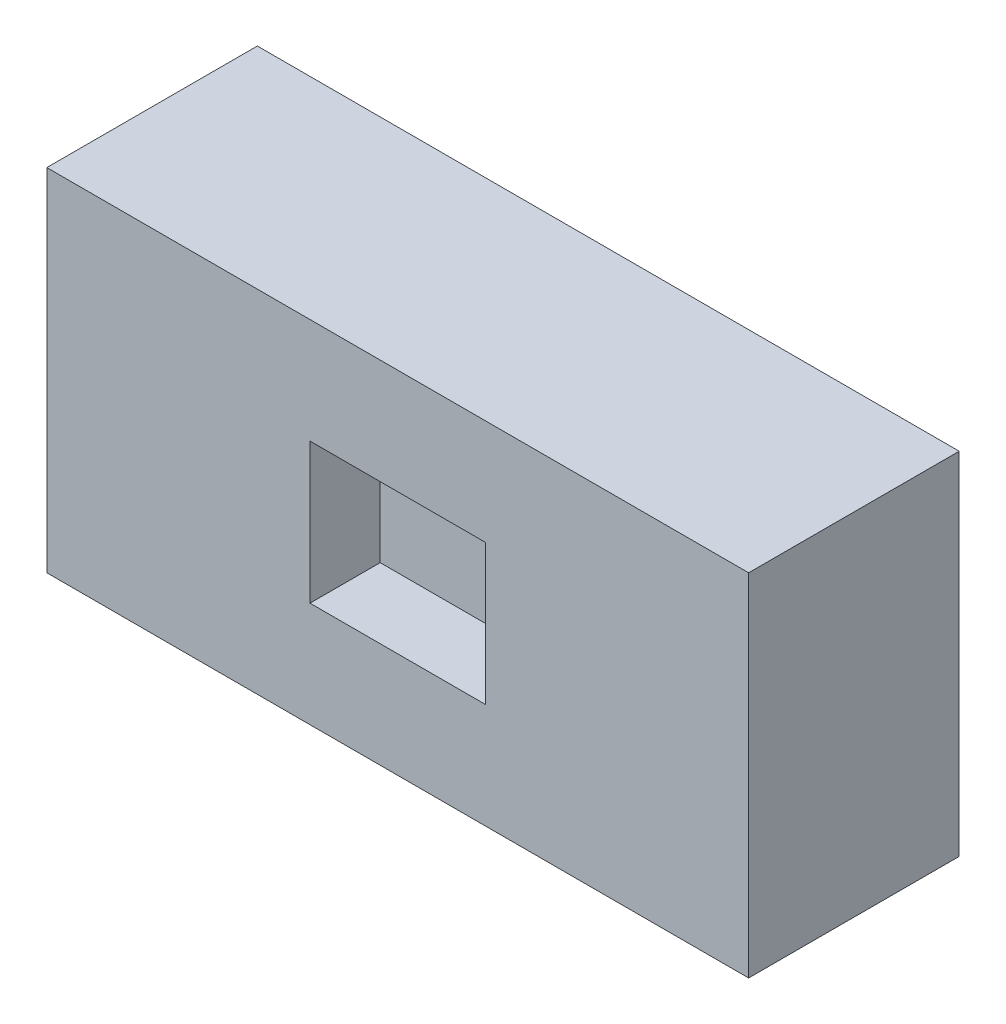
ISO-10303-21;
HEADER;
FILE_DESCRIPTION(('STEP AP214'),'2;1');
FILE_NAME('part.step','',(''),(''),'','','');
FILE_SCHEMA(('AUTOMOTIVE_DESIGN { 1 0 10303 214 1 1 1 1 }'));
ENDSEC;
DATA;
#1=APPLICATION_CONTEXT('core data for automotive mechanical design processes');
#2=APPLICATION_PROTOCOL_DEFINITION('international standard','automotive_design',2000,#1);
#3=PRODUCT_CONTEXT('',#1,'mechanical');
#4=PRODUCT('Part','Part','',(#3));
#5=PRODUCT_RELATED_PRODUCT_CATEGORY('part','',(#4));
#6=PRODUCT_DEFINITION_FORMATION('','',#4);
#7=PRODUCT_DEFINITION_CONTEXT('part definition',#1,'design');
#8=PRODUCT_DEFINITION('design','',#6,#7);
#9=PRODUCT_DEFINITION_SHAPE('','',#8);
#10=(LENGTH_UNIT() NAMED_UNIT(*) SI_UNIT(.MILLI.,.METRE.));
#11=(NAMED_UNIT(*) PLANE_ANGLE_UNIT() SI_UNIT($,.RADIAN.));
#12=(NAMED_UNIT(*) SI_UNIT($,.STERADIAN.) SOLID_ANGLE_UNIT());
#13=UNCERTAINTY_MEASURE_WITH_UNIT(LENGTH_MEASURE(1.E-05),#10,'distance_accuracy_value','');
#14=(GEOMETRIC_REPRESENTATION_CONTEXT(3) GLOBAL_UNCERTAINTY_ASSIGNED_CONTEXT((#13)) GLOBAL_UNIT_ASSIGNED_CONTEXT((#10,
#11,#12)) REPRESENTATION_CONTEXT('',''));
#15=CARTESIAN_POINT('',(0.,0.,0.));
#16=DIRECTION('',(0.,0.,1.));
#17=DIRECTION('',(1.,0.,0.));
#18=AXIS2_PLACEMENT_3D('',#15,#16,#17);
#19=CARTESIAN_POINT('',(0.,0.,12.));
#20=DIRECTION('',(1.,0.,0.));
#21=DIRECTION('',(0.,0.,-1.));
#22=AXIS2_PLACEMENT_3D('',#19,#20,#21);
#23=PLANE('',#22);
#24=DIRECTION('',(0.,-1.,0.));
#25=VECTOR('',#24,1.);
#26=CARTESIAN_POINT('',(0.,0.,0.));
#27=LINE('',#26,#25);
#28=CARTESIAN_POINT('',(0.,20.,0.));
#29=VERTEX_POINT('',#28);
#30=CARTESIAN_POINT('',(0.,0.,0.));
#31=VERTEX_POINT('',#30);
#32=EDGE_CURVE('E153',#29,#31,#27,.T.);
#33=ORIENTED_EDGE('',*,*,#32,.T.);
#34=DIRECTION('',(0.,0.,-1.));
#35=VECTOR('',#34,1.);
#36=CARTESIAN_POINT('',(0.,0.,12.));
#37=LINE('',#36,#35);
#38=CARTESIAN_POINT('',(0.,0.,12.));
#39=VERTEX_POINT('',#38);
#40=EDGE_CURVE('E11',#39,#31,#37,.T.);
#41=ORIENTED_EDGE('',*,*,#40,.F.);
#42=DIRECTION('',(0.,-1.,0.));
#43=VECTOR('',#42,1.);
#44=CARTESIAN_POINT('',(0.,0.,12.));
#45=LINE('',#44,#43);
#46=CARTESIAN_POINT('',(0.,20.,12.));
#47=VERTEX_POINT('',#46);
#48=EDGE_CURVE('E160',#47,#39,#45,.T.);
#49=ORIENTED_EDGE('',*,*,#48,.F.);
#50=DIRECTION('',(0.,0.,-1.));
#51=VECTOR('',#50,1.);
#52=CARTESIAN_POINT('',(0.,20.,12.));
#53=LINE('',#52,#51);
#54=EDGE_CURVE('E162',#47,#29,#53,.T.);
#55=ORIENTED_EDGE('',*,*,#54,.T.);
#56=EDGE_LOOP('',(#33,#41,#49,#55));
#57=FACE_BOUND('',#56,.T.);
#58=ADVANCED_FACE('F44',(#57),#23,.F.);
#59=CARTESIAN_POINT('',(0.,0.,12.));
#60=DIRECTION('',(0.,1.,0.));
#61=DIRECTION('',(0.,0.,1.));
#62=AXIS2_PLACEMENT_3D('',#59,#60,#61);
#63=PLANE('',#62);
#64=DIRECTION('',(1.,0.,0.));
#65=VECTOR('',#64,1.);
#66=CARTESIAN_POINT('',(0.,0.,0.));
#67=LINE('',#66,#65);
#68=CARTESIAN_POINT('',(40.,0.,0.));
#69=VERTEX_POINT('',#68);
#70=EDGE_CURVE('E167',#31,#69,#67,.T.);
#71=ORIENTED_EDGE('',*,*,#70,.T.);
#72=DIRECTION('',(0.,0.,-1.));
#73=VECTOR('',#72,1.);
#74=CARTESIAN_POINT('',(40.,0.,12.));
#75=LINE('',#74,#73);
#76=CARTESIAN_POINT('',(40.,0.,12.));
#77=VERTEX_POINT('',#76);
#78=EDGE_CURVE('E55',#77,#69,#75,.T.);
#79=ORIENTED_EDGE('',*,*,#78,.F.);
#80=DIRECTION('',(1.,0.,0.));
#81=VECTOR('',#80,1.);
#82=CARTESIAN_POINT('',(0.,0.,12.));
#83=LINE('',#82,#81);
#84=EDGE_CURVE('E96',#39,#77,#83,.T.);
#85=ORIENTED_EDGE('',*,*,#84,.F.);
#86=ORIENTED_EDGE('',*,*,#40,.T.);
#87=EDGE_LOOP('',(#71,#79,#85,#86));
#88=FACE_BOUND('',#87,.T.);
#89=ADVANCED_FACE('F198',(#88),#63,.F.);
#90=CARTESIAN_POINT('',(40.,0.,12.));
#91=DIRECTION('',(-1.,0.,0.));
#92=DIRECTION('',(0.,0.,1.));
#93=AXIS2_PLACEMENT_3D('',#90,#91,#92);
#94=PLANE('',#93);
#95=DIRECTION('',(0.,1.,0.));
#96=VECTOR('',#95,1.);
#97=CARTESIAN_POINT('',(40.,0.,0.));
#98=LINE('',#97,#96);
#99=CARTESIAN_POINT('',(40.,20.,0.));
#100=VERTEX_POINT('',#99);
#101=EDGE_CURVE('E169',#69,#100,#98,.T.);
#102=ORIENTED_EDGE('',*,*,#101,.T.);
#103=DIRECTION('',(0.,0.,-1.));
#104=VECTOR('',#103,1.);
#105=CARTESIAN_POINT('',(40.,20.,12.));
#106=LINE('',#105,#104);
#107=CARTESIAN_POINT('',(40.,20.,12.));
#108=VERTEX_POINT('',#107);
#109=EDGE_CURVE('E174',#108,#100,#106,.T.);
#110=ORIENTED_EDGE('',*,*,#109,.F.);
#111=DIRECTION('',(0.,1.,0.));
#112=VECTOR('',#111,1.);
#113=CARTESIAN_POINT('',(40.,0.,12.));
#114=LINE('',#113,#112);
#115=EDGE_CURVE('E159',#77,#108,#114,.T.);
#116=ORIENTED_EDGE('',*,*,#115,.F.);
#117=ORIENTED_EDGE('',*,*,#78,.T.);
#118=EDGE_LOOP('',(#102,#110,#116,#117));
#119=FACE_BOUND('',#118,.T.);
#120=ADVANCED_FACE('F177',(#119),#94,.F.);
#121=CARTESIAN_POINT('',(0.,20.,12.));
#122=DIRECTION('',(0.,-1.,0.));
#123=DIRECTION('',(0.,0.,-1.));
#124=AXIS2_PLACEMENT_3D('',#121,#122,#123);
#125=PLANE('',#124);
#126=DIRECTION('',(-1.,0.,0.));
#127=VECTOR('',#126,1.);
#128=CARTESIAN_POINT('',(0.,20.,0.));
#129=LINE('',#128,#127);
#130=EDGE_CURVE('E90',#100,#29,#129,.T.);
#131=ORIENTED_EDGE('',*,*,#130,.T.);
#132=ORIENTED_EDGE('',*,*,#54,.F.);
#133=DIRECTION('',(-1.,0.,0.));
#134=VECTOR('',#133,1.);
#135=CARTESIAN_POINT('',(0.,20.,12.));
#136=LINE('',#135,#134);
#137=EDGE_CURVE('E69',#108,#47,#136,.T.);
#138=ORIENTED_EDGE('',*,*,#137,.F.);
#139=ORIENTED_EDGE('',*,*,#109,.T.);
#140=EDGE_LOOP('',(#131,#132,#138,#139));
#141=FACE_BOUND('',#140,.T.);
#142=ADVANCED_FACE('F183',(#141),#125,.F.);
#143=CARTESIAN_POINT('',(0.,0.,12.));
#144=DIRECTION('',(0.,0.,-1.));
#145=DIRECTION('',(-1.,0.,0.));
#146=AXIS2_PLACEMENT_3D('',#143,#144,#145);
#147=PLANE('',#146);
#148=DIRECTION('',(1.,0.,0.));
#149=VECTOR('',#148,1.);
#150=CARTESIAN_POINT('',(15.,6.,12.));
#151=LINE('',#150,#149);
#152=CARTESIAN_POINT('',(15.,6.,12.));
#153=VERTEX_POINT('',#152);
#154=CARTESIAN_POINT('',(25.,6.,12.));
#155=VERTEX_POINT('',#154);
#156=EDGE_CURVE('E150',#153,#155,#151,.T.);
#157=ORIENTED_EDGE('',*,*,#156,.F.);
#158=DIRECTION('',(0.,-1.,0.));
#159=VECTOR('',#158,1.);
#160=CARTESIAN_POINT('',(15.,6.,12.));
#161=LINE('',#160,#159);
#162=CARTESIAN_POINT('',(15.,14.,12.));
#163=VERTEX_POINT('',#162);
#164=EDGE_CURVE('E56',#163,#153,#161,.T.);
#165=ORIENTED_EDGE('',*,*,#164,.F.);
#166=DIRECTION('',(-1.,0.,0.));
#167=VECTOR('',#166,1.);
#168=CARTESIAN_POINT('',(15.,14.,12.));
#169=LINE('',#168,#167);
#170=CARTESIAN_POINT('',(25.,14.,12.));
#171=VERTEX_POINT('',#170);
#172=EDGE_CURVE('E139',#171,#163,#169,.T.);
#173=ORIENTED_EDGE('',*,*,#172,.F.);
#174=DIRECTION('',(0.,1.,0.));
#175=VECTOR('',#174,1.);
#176=CARTESIAN_POINT('',(25.,6.,12.));
#177=LINE('',#176,#175);
#178=EDGE_CURVE('E143',#155,#171,#177,.T.);
#179=ORIENTED_EDGE('',*,*,#178,.F.);
#180=EDGE_LOOP('',(#157,#165,#173,#179));
#181=FACE_BOUND('',#180,.T.);
#182=ORIENTED_EDGE('',*,*,#48,.T.);
#183=ORIENTED_EDGE('',*,*,#84,.T.);
#184=ORIENTED_EDGE('',*,*,#115,.T.);
#185=ORIENTED_EDGE('',*,*,#137,.T.);
#186=EDGE_LOOP('',(#182,#183,#184,#185));
#187=FACE_BOUND('',#186,.T.);
#188=ADVANCED_FACE('F189',(#181,#187),#147,.F.);
#189=CARTESIAN_POINT('',(0.,0.,0.));
#190=DIRECTION('',(0.,0.,-1.));
#191=DIRECTION('',(-1.,0.,0.));
#192=AXIS2_PLACEMENT_3D('',#189,#190,#191);
#193=PLANE('',#192);
#194=ORIENTED_EDGE('',*,*,#32,.F.);
#195=ORIENTED_EDGE('',*,*,#130,.F.);
#196=ORIENTED_EDGE('',*,*,#101,.F.);
#197=ORIENTED_EDGE('',*,*,#70,.F.);
#198=EDGE_LOOP('',(#194,#195,#196,#197));
#199=FACE_BOUND('',#198,.T.);
#200=ADVANCED_FACE('F182',(#199),#193,.T.);
#201=CARTESIAN_POINT('',(15.,6.,8.));
#202=DIRECTION('',(-1.,0.,0.));
#203=DIRECTION('',(0.,0.,1.));
#204=AXIS2_PLACEMENT_3D('',#201,#202,#203);
#205=PLANE('',#204);
#206=ORIENTED_EDGE('',*,*,#164,.T.);
#207=DIRECTION('',(0.,0.,1.));
#208=VECTOR('',#207,1.);
#209=CARTESIAN_POINT('',(15.,6.,8.));
#210=LINE('',#209,#208);
#211=CARTESIAN_POINT('',(15.,6.,8.));
#212=VERTEX_POINT('',#211);
#213=EDGE_CURVE('E118',#212,#153,#210,.T.);
#214=ORIENTED_EDGE('',*,*,#213,.F.);
#215=DIRECTION('',(0.,-1.,0.));
#216=VECTOR('',#215,1.);
#217=CARTESIAN_POINT('',(15.,6.,8.));
#218=LINE('',#217,#216);
#219=CARTESIAN_POINT('',(15.,14.,8.));
#220=VERTEX_POINT('',#219);
#221=EDGE_CURVE('E116',#220,#212,#218,.T.);
#222=ORIENTED_EDGE('',*,*,#221,.F.);
#223=DIRECTION('',(0.,0.,1.));
#224=VECTOR('',#223,1.);
#225=CARTESIAN_POINT('',(15.,14.,8.));
#226=LINE('',#225,#224);
#227=EDGE_CURVE('E151',#220,#163,#226,.T.);
#228=ORIENTED_EDGE('',*,*,#227,.T.);
#229=EDGE_LOOP('',(#206,#214,#222,#228));
#230=FACE_BOUND('',#229,.T.);
#231=ADVANCED_FACE('F117',(#230),#205,.F.);
#232=CARTESIAN_POINT('',(15.,14.,8.));
#233=DIRECTION('',(0.,1.,0.));
#234=DIRECTION('',(0.,0.,1.));
#235=AXIS2_PLACEMENT_3D('',#232,#233,#234);
#236=PLANE('',#235);
#237=ORIENTED_EDGE('',*,*,#172,.T.);
#238=ORIENTED_EDGE('',*,*,#227,.F.);
#239=DIRECTION('',(-1.,0.,0.));
#240=VECTOR('',#239,1.);
#241=CARTESIAN_POINT('',(15.,14.,8.));
#242=LINE('',#241,#240);
#243=CARTESIAN_POINT('',(25.,14.,8.));
#244=VERTEX_POINT('',#243);
#245=EDGE_CURVE('E127',#244,#220,#242,.T.);
#246=ORIENTED_EDGE('',*,*,#245,.F.);
#247=DIRECTION('',(0.,0.,1.));
#248=VECTOR('',#247,1.);
#249=CARTESIAN_POINT('',(25.,14.,8.));
#250=LINE('',#249,#248);
#251=EDGE_CURVE('E152',#244,#171,#250,.T.);
#252=ORIENTED_EDGE('',*,*,#251,.T.);
#253=EDGE_LOOP('',(#237,#238,#246,#252));
#254=FACE_BOUND('',#253,.T.);
#255=ADVANCED_FACE('F240',(#254),#236,.F.);
#256=CARTESIAN_POINT('',(25.,6.,8.));
#257=DIRECTION('',(1.,0.,0.));
#258=DIRECTION('',(0.,0.,-1.));
#259=AXIS2_PLACEMENT_3D('',#256,#257,#258);
#260=PLANE('',#259);
#261=ORIENTED_EDGE('',*,*,#178,.T.);
#262=ORIENTED_EDGE('',*,*,#251,.F.);
#263=DIRECTION('',(0.,1.,0.));
#264=VECTOR('',#263,1.);
#265=CARTESIAN_POINT('',(25.,6.,8.));
#266=LINE('',#265,#264);
#267=CARTESIAN_POINT('',(25.,6.,8.));
#268=VERTEX_POINT('',#267);
#269=EDGE_CURVE('E135',#268,#244,#266,.T.);
#270=ORIENTED_EDGE('',*,*,#269,.F.);
#271=DIRECTION('',(0.,0.,1.));
#272=VECTOR('',#271,1.);
#273=CARTESIAN_POINT('',(25.,6.,8.));
#274=LINE('',#273,#272);
#275=EDGE_CURVE('E125',#268,#155,#274,.T.);
#276=ORIENTED_EDGE('',*,*,#275,.T.);
#277=EDGE_LOOP('',(#261,#262,#270,#276));
#278=FACE_BOUND('',#277,.T.);
#279=ADVANCED_FACE('F246',(#278),#260,.F.);
#280=CARTESIAN_POINT('',(15.,6.,8.));
#281=DIRECTION('',(0.,-1.,0.));
#282=DIRECTION('',(0.,0.,-1.));
#283=AXIS2_PLACEMENT_3D('',#280,#281,#282);
#284=PLANE('',#283);
#285=ORIENTED_EDGE('',*,*,#156,.T.);
#286=ORIENTED_EDGE('',*,*,#275,.F.);
#287=DIRECTION('',(1.,0.,0.));
#288=VECTOR('',#287,1.);
#289=CARTESIAN_POINT('',(15.,6.,8.));
#290=LINE('',#289,#288);
#291=EDGE_CURVE('E129',#212,#268,#290,.T.);
#292=ORIENTED_EDGE('',*,*,#291,.F.);
#293=ORIENTED_EDGE('',*,*,#213,.T.);
#294=EDGE_LOOP('',(#285,#286,#292,#293));
#295=FACE_BOUND('',#294,.T.);
#296=ADVANCED_FACE('F128',(#295),#284,.F.);
#297=CARTESIAN_POINT('',(0.,0.,8.));
#298=DIRECTION('',(0.,0.,-1.));
#299=DIRECTION('',(-1.,0.,0.));
#300=AXIS2_PLACEMENT_3D('',#297,#298,#299);
#301=PLANE('',#300);
#302=ORIENTED_EDGE('',*,*,#221,.T.);
#303=ORIENTED_EDGE('',*,*,#291,.T.);
#304=ORIENTED_EDGE('',*,*,#269,.T.);
#305=ORIENTED_EDGE('',*,*,#245,.T.);
#306=EDGE_LOOP('',(#302,#303,#304,#305));
#307=FACE_BOUND('',#306,.T.);
#308=ADVANCED_FACE('F136',(#307),#301,.F.);
#309=CLOSED_SHELL('',(#58,#89,#120,#142,#188,#200,#231,#255,#279,#296,#308));
#310=MANIFOLD_SOLID_BREP('B2',#309);
#311=ADVANCED_BREP_SHAPE_REPRESENTATION('',(#18,#310),#14);
#312=SHAPE_DEFINITION_REPRESENTATION(#9,#311);
ENDSEC;
END-ISO-10303-21;
